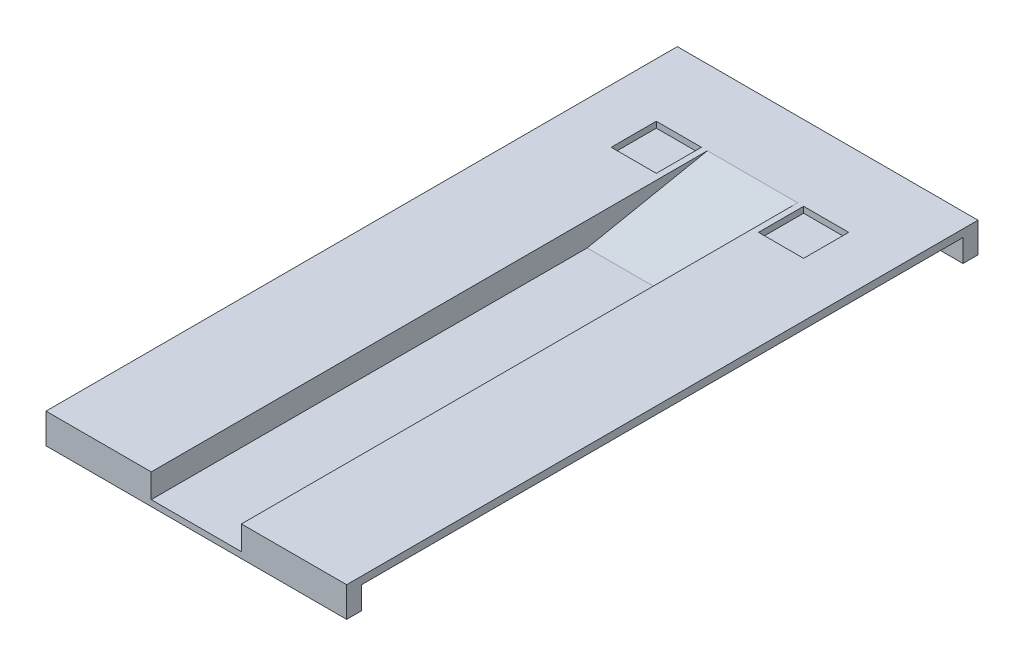
ISO-10303-21;
HEADER;
FILE_DESCRIPTION(('STEP AP214'),'2;1');
FILE_NAME('part.step','',(''),(''),'','','');
FILE_SCHEMA(('AUTOMOTIVE_DESIGN { 1 0 10303 214 1 1 1 1 }'));
ENDSEC;
DATA;
#1=APPLICATION_CONTEXT('core data for automotive mechanical design processes');
#2=APPLICATION_PROTOCOL_DEFINITION('international standard','automotive_design',2000,#1);
#3=PRODUCT_CONTEXT('',#1,'mechanical');
#4=PRODUCT('Part','Part','',(#3));
#5=PRODUCT_RELATED_PRODUCT_CATEGORY('part','',(#4));
#6=PRODUCT_DEFINITION_FORMATION('','',#4);
#7=PRODUCT_DEFINITION_CONTEXT('part definition',#1,'design');
#8=PRODUCT_DEFINITION('design','',#6,#7);
#9=PRODUCT_DEFINITION_SHAPE('','',#8);
#10=(LENGTH_UNIT() NAMED_UNIT(*) SI_UNIT(.MILLI.,.METRE.));
#11=(NAMED_UNIT(*) PLANE_ANGLE_UNIT() SI_UNIT($,.RADIAN.));
#12=(NAMED_UNIT(*) SI_UNIT($,.STERADIAN.) SOLID_ANGLE_UNIT());
#13=UNCERTAINTY_MEASURE_WITH_UNIT(LENGTH_MEASURE(1.E-05),#10,'distance_accuracy_value','');
#14=(GEOMETRIC_REPRESENTATION_CONTEXT(3) GLOBAL_UNCERTAINTY_ASSIGNED_CONTEXT((#13)) GLOBAL_UNIT_ASSIGNED_CONTEXT((#10,
#11,#12)) REPRESENTATION_CONTEXT('',''));
#15=CARTESIAN_POINT('',(0.,0.,0.));
#16=DIRECTION('',(0.,0.,1.));
#17=DIRECTION('',(1.,0.,0.));
#18=AXIS2_PLACEMENT_3D('',#15,#16,#17);
#19=CARTESIAN_POINT('',(35.,2.,210.));
#20=DIRECTION('',(-1.,0.,0.));
#21=DIRECTION('',(0.,0.,1.));
#22=AXIS2_PLACEMENT_3D('',#19,#20,#21);
#23=PLANE('',#22);
#24=DIRECTION('',(0.,0.196116135138184,-0.98058067569092));
#25=VECTOR('',#24,1.);
#26=CARTESIAN_POINT('',(35.,2.,65.));
#27=LINE('',#26,#25);
#28=CARTESIAN_POINT('',(35.,2.,65.));
#29=VERTEX_POINT('',#28);
#30=CARTESIAN_POINT('',(35.,10.,25.));
#31=VERTEX_POINT('',#30);
#32=EDGE_CURVE('E378',#29,#31,#27,.T.);
#33=ORIENTED_EDGE('',*,*,#32,.T.);
#34=DIRECTION('',(0.,0.,1.));
#35=VECTOR('',#34,1.);
#36=CARTESIAN_POINT('',(35.,10.,210.));
#37=LINE('',#36,#35);
#38=CARTESIAN_POINT('',(35.,10.,210.));
#39=VERTEX_POINT('',#38);
#40=EDGE_CURVE('E393',#31,#39,#37,.T.);
#41=ORIENTED_EDGE('',*,*,#40,.T.);
#42=DIRECTION('',(0.,1.,0.));
#43=VECTOR('',#42,1.);
#44=CARTESIAN_POINT('',(35.,2.,210.));
#45=LINE('',#44,#43);
#46=CARTESIAN_POINT('',(35.,2.,210.));
#47=VERTEX_POINT('',#46);
#48=EDGE_CURVE('E409',#47,#39,#45,.T.);
#49=ORIENTED_EDGE('',*,*,#48,.F.);
#50=DIRECTION('',(0.,0.,1.));
#51=VECTOR('',#50,1.);
#52=CARTESIAN_POINT('',(35.,2.,210.));
#53=LINE('',#52,#51);
#54=EDGE_CURVE('E397',#29,#47,#53,.T.);
#55=ORIENTED_EDGE('',*,*,#54,.F.);
#56=EDGE_LOOP('',(#33,#41,#49,#55));
#57=FACE_BOUND('',#56,.T.);
#58=ADVANCED_FACE('F45',(#57),#23,.F.);
#59=CARTESIAN_POINT('',(65.,2.,210.));
#60=DIRECTION('',(1.,0.,0.));
#61=DIRECTION('',(0.,0.,-1.));
#62=AXIS2_PLACEMENT_3D('',#59,#60,#61);
#63=PLANE('',#62);
#64=DIRECTION('',(0.,0.196116135138184,-0.98058067569092));
#65=VECTOR('',#64,1.);
#66=CARTESIAN_POINT('',(65.,2.,65.));
#67=LINE('',#66,#65);
#68=CARTESIAN_POINT('',(65.,2.,65.));
#69=VERTEX_POINT('',#68);
#70=CARTESIAN_POINT('',(65.,10.,25.));
#71=VERTEX_POINT('',#70);
#72=EDGE_CURVE('E369',#69,#71,#67,.T.);
#73=ORIENTED_EDGE('',*,*,#72,.F.);
#74=DIRECTION('',(0.,0.,-1.));
#75=VECTOR('',#74,1.);
#76=CARTESIAN_POINT('',(65.,2.,210.));
#77=LINE('',#76,#75);
#78=CARTESIAN_POINT('',(65.,2.,210.));
#79=VERTEX_POINT('',#78);
#80=EDGE_CURVE('E392',#79,#69,#77,.T.);
#81=ORIENTED_EDGE('',*,*,#80,.F.);
#82=DIRECTION('',(0.,1.,0.));
#83=VECTOR('',#82,1.);
#84=CARTESIAN_POINT('',(65.,2.,210.));
#85=LINE('',#84,#83);
#86=CARTESIAN_POINT('',(65.,10.,210.));
#87=VERTEX_POINT('',#86);
#88=EDGE_CURVE('E400',#79,#87,#85,.T.);
#89=ORIENTED_EDGE('',*,*,#88,.T.);
#90=DIRECTION('',(0.,0.,-1.));
#91=VECTOR('',#90,1.);
#92=CARTESIAN_POINT('',(65.,10.,210.));
#93=LINE('',#92,#91);
#94=EDGE_CURVE('E387',#87,#71,#93,.T.);
#95=ORIENTED_EDGE('',*,*,#94,.T.);
#96=EDGE_LOOP('',(#73,#81,#89,#95));
#97=FACE_BOUND('',#96,.T.);
#98=ADVANCED_FACE('F517',(#97),#63,.F.);
#99=CARTESIAN_POINT('',(0.,2.,0.));
#100=DIRECTION('',(0.,1.,0.));
#101=DIRECTION('',(0.,0.,1.));
#102=AXIS2_PLACEMENT_3D('',#99,#100,#101);
#103=PLANE('',#102);
#104=ORIENTED_EDGE('',*,*,#80,.T.);
#105=DIRECTION('',(1.,0.,0.));
#106=VECTOR('',#105,1.);
#107=CARTESIAN_POINT('',(35.,2.,65.));
#108=LINE('',#107,#106);
#109=EDGE_CURVE('E382',#29,#69,#108,.T.);
#110=ORIENTED_EDGE('',*,*,#109,.F.);
#111=ORIENTED_EDGE('',*,*,#54,.T.);
#112=DIRECTION('',(1.,0.,0.));
#113=VECTOR('',#112,1.);
#114=CARTESIAN_POINT('',(35.,2.,210.));
#115=LINE('',#114,#113);
#116=EDGE_CURVE('E388',#47,#79,#115,.T.);
#117=ORIENTED_EDGE('',*,*,#116,.T.);
#118=EDGE_LOOP('',(#104,#110,#111,#117));
#119=FACE_BOUND('',#118,.T.);
#120=ADVANCED_FACE('F520',(#119),#103,.T.);
#121=CARTESIAN_POINT('',(0.,10.,210.));
#122=DIRECTION('',(1.,0.,0.));
#123=DIRECTION('',(0.,0.,-1.));
#124=AXIS2_PLACEMENT_3D('',#121,#122,#123);
#125=PLANE('',#124);
#126=DIRECTION('',(0.,0.,1.));
#127=VECTOR('',#126,1.);
#128=CARTESIAN_POINT('',(0.,0.,210.));
#129=LINE('',#128,#127);
#130=CARTESIAN_POINT('',(0.,0.,0.));
#131=VERTEX_POINT('',#130);
#132=CARTESIAN_POINT('',(0.,0.,5.));
#133=VERTEX_POINT('',#132);
#134=EDGE_CURVE('E433',#131,#133,#129,.T.);
#135=ORIENTED_EDGE('',*,*,#134,.T.);
#136=DIRECTION('',(0.,-1.,0.));
#137=VECTOR('',#136,1.);
#138=CARTESIAN_POINT('',(0.,0.,5.));
#139=LINE('',#138,#137);
#140=CARTESIAN_POINT('',(0.,7.5,5.));
#141=VERTEX_POINT('',#140);
#142=EDGE_CURVE('E305',#141,#133,#139,.T.);
#143=ORIENTED_EDGE('',*,*,#142,.F.);
#144=DIRECTION('',(0.,0.,-1.));
#145=VECTOR('',#144,1.);
#146=CARTESIAN_POINT('',(0.,7.5,5.));
#147=LINE('',#146,#145);
#148=CARTESIAN_POINT('',(0.,7.5,205.));
#149=VERTEX_POINT('',#148);
#150=EDGE_CURVE('E320',#149,#141,#147,.T.);
#151=ORIENTED_EDGE('',*,*,#150,.F.);
#152=DIRECTION('',(0.,1.,0.));
#153=VECTOR('',#152,1.);
#154=CARTESIAN_POINT('',(0.,7.5,205.));
#155=LINE('',#154,#153);
#156=CARTESIAN_POINT('',(0.,0.,205.));
#157=VERTEX_POINT('',#156);
#158=EDGE_CURVE('E253',#157,#149,#155,.T.);
#159=ORIENTED_EDGE('',*,*,#158,.F.);
#160=CARTESIAN_POINT('',(0.,0.,210.));
#161=VERTEX_POINT('',#160);
#162=EDGE_CURVE('E413',#157,#161,#129,.T.);
#163=ORIENTED_EDGE('',*,*,#162,.T.);
#164=DIRECTION('',(0.,-1.,0.));
#165=VECTOR('',#164,1.);
#166=CARTESIAN_POINT('',(0.,10.,210.));
#167=LINE('',#166,#165);
#168=CARTESIAN_POINT('',(0.,10.,210.));
#169=VERTEX_POINT('',#168);
#170=EDGE_CURVE('E11',#169,#161,#167,.T.);
#171=ORIENTED_EDGE('',*,*,#170,.F.);
#172=DIRECTION('',(0.,0.,1.));
#173=VECTOR('',#172,1.);
#174=CARTESIAN_POINT('',(0.,10.,210.));
#175=LINE('',#174,#173);
#176=CARTESIAN_POINT('',(0.,10.,0.));
#177=VERTEX_POINT('',#176);
#178=EDGE_CURVE('E416',#177,#169,#175,.T.);
#179=ORIENTED_EDGE('',*,*,#178,.F.);
#180=DIRECTION('',(0.,-1.,0.));
#181=VECTOR('',#180,1.);
#182=CARTESIAN_POINT('',(0.,10.,0.));
#183=LINE('',#182,#181);
#184=EDGE_CURVE('E432',#177,#131,#183,.T.);
#185=ORIENTED_EDGE('',*,*,#184,.T.);
#186=EDGE_LOOP('',(#135,#143,#151,#159,#163,#171,#179,#185));
#187=FACE_BOUND('',#186,.T.);
#188=ADVANCED_FACE('F47',(#187),#125,.F.);
#189=CARTESIAN_POINT('',(100.,10.,210.));
#190=DIRECTION('',(0.,0.,-1.));
#191=DIRECTION('',(-1.,0.,0.));
#192=AXIS2_PLACEMENT_3D('',#189,#190,#191);
#193=PLANE('',#192);
#194=ORIENTED_EDGE('',*,*,#116,.F.);
#195=ORIENTED_EDGE('',*,*,#48,.T.);
#196=DIRECTION('',(1.,0.,0.));
#197=VECTOR('',#196,1.);
#198=CARTESIAN_POINT('',(100.,10.,210.));
#199=LINE('',#198,#197);
#200=EDGE_CURVE('E422',#169,#39,#199,.T.);
#201=ORIENTED_EDGE('',*,*,#200,.F.);
#202=ORIENTED_EDGE('',*,*,#170,.T.);
#203=DIRECTION('',(1.,0.,0.));
#204=VECTOR('',#203,1.);
#205=CARTESIAN_POINT('',(100.,0.,210.));
#206=LINE('',#205,#204);
#207=CARTESIAN_POINT('',(100.,0.,210.));
#208=VERTEX_POINT('',#207);
#209=EDGE_CURVE('E437',#161,#208,#206,.T.);
#210=ORIENTED_EDGE('',*,*,#209,.T.);
#211=DIRECTION('',(0.,-1.,0.));
#212=VECTOR('',#211,1.);
#213=CARTESIAN_POINT('',(100.,10.,210.));
#214=LINE('',#213,#212);
#215=CARTESIAN_POINT('',(100.,10.,210.));
#216=VERTEX_POINT('',#215);
#217=EDGE_CURVE('E54',#216,#208,#214,.T.);
#218=ORIENTED_EDGE('',*,*,#217,.F.);
#219=EDGE_CURVE('E420',#87,#216,#199,.T.);
#220=ORIENTED_EDGE('',*,*,#219,.F.);
#221=ORIENTED_EDGE('',*,*,#88,.F.);
#222=EDGE_LOOP('',(#194,#195,#201,#202,#210,#218,#220,#221));
#223=FACE_BOUND('',#222,.T.);
#224=ADVANCED_FACE('F514',(#223),#193,.F.);
#225=CARTESIAN_POINT('',(100.,10.,0.));
#226=DIRECTION('',(-1.,0.,0.));
#227=DIRECTION('',(0.,0.,1.));
#228=AXIS2_PLACEMENT_3D('',#225,#226,#227);
#229=PLANE('',#228);
#230=DIRECTION('',(0.,0.,-1.));
#231=VECTOR('',#230,1.);
#232=CARTESIAN_POINT('',(100.,0.,0.));
#233=LINE('',#232,#231);
#234=CARTESIAN_POINT('',(100.,0.,205.));
#235=VERTEX_POINT('',#234);
#236=EDGE_CURVE('E441',#208,#235,#233,.T.);
#237=ORIENTED_EDGE('',*,*,#236,.T.);
#238=DIRECTION('',(0.,-1.,0.));
#239=VECTOR('',#238,1.);
#240=CARTESIAN_POINT('',(100.,0.,205.));
#241=LINE('',#240,#239);
#242=CARTESIAN_POINT('',(100.,7.5,205.));
#243=VERTEX_POINT('',#242);
#244=EDGE_CURVE('E344',#243,#235,#241,.T.);
#245=ORIENTED_EDGE('',*,*,#244,.F.);
#246=DIRECTION('',(0.,0.,1.));
#247=VECTOR('',#246,1.);
#248=CARTESIAN_POINT('',(100.,7.5,205.));
#249=LINE('',#248,#247);
#250=CARTESIAN_POINT('',(100.,7.5,4.99999999999996));
#251=VERTEX_POINT('',#250);
#252=EDGE_CURVE('E359',#251,#243,#249,.T.);
#253=ORIENTED_EDGE('',*,*,#252,.F.);
#254=DIRECTION('',(0.,1.,0.));
#255=VECTOR('',#254,1.);
#256=CARTESIAN_POINT('',(100.,7.5,4.99999999999996));
#257=LINE('',#256,#255);
#258=CARTESIAN_POINT('',(100.,0.,4.99999999999996));
#259=VERTEX_POINT('',#258);
#260=EDGE_CURVE('E330',#259,#251,#257,.T.);
#261=ORIENTED_EDGE('',*,*,#260,.F.);
#262=CARTESIAN_POINT('',(100.,0.,0.));
#263=VERTEX_POINT('',#262);
#264=EDGE_CURVE('E440',#259,#263,#233,.T.);
#265=ORIENTED_EDGE('',*,*,#264,.T.);
#266=DIRECTION('',(0.,-1.,0.));
#267=VECTOR('',#266,1.);
#268=CARTESIAN_POINT('',(100.,10.,0.));
#269=LINE('',#268,#267);
#270=CARTESIAN_POINT('',(100.,10.,0.));
#271=VERTEX_POINT('',#270);
#272=EDGE_CURVE('E450',#271,#263,#269,.T.);
#273=ORIENTED_EDGE('',*,*,#272,.F.);
#274=DIRECTION('',(0.,0.,-1.));
#275=VECTOR('',#274,1.);
#276=CARTESIAN_POINT('',(100.,10.,0.));
#277=LINE('',#276,#275);
#278=EDGE_CURVE('E426',#216,#271,#277,.T.);
#279=ORIENTED_EDGE('',*,*,#278,.F.);
#280=ORIENTED_EDGE('',*,*,#217,.T.);
#281=EDGE_LOOP('',(#237,#245,#253,#261,#265,#273,#279,#280));
#282=FACE_BOUND('',#281,.T.);
#283=ADVANCED_FACE('F459',(#282),#229,.F.);
#284=CARTESIAN_POINT('',(0.,10.,0.));
#285=DIRECTION('',(0.,0.,1.));
#286=DIRECTION('',(1.,0.,0.));
#287=AXIS2_PLACEMENT_3D('',#284,#285,#286);
#288=PLANE('',#287);
#289=DIRECTION('',(-1.,0.,0.));
#290=VECTOR('',#289,1.);
#291=CARTESIAN_POINT('',(0.,0.,0.));
#292=LINE('',#291,#290);
#293=EDGE_CURVE('E421',#263,#131,#292,.T.);
#294=ORIENTED_EDGE('',*,*,#293,.T.);
#295=ORIENTED_EDGE('',*,*,#184,.F.);
#296=DIRECTION('',(-1.,0.,0.));
#297=VECTOR('',#296,1.);
#298=CARTESIAN_POINT('',(0.,10.,0.));
#299=LINE('',#298,#297);
#300=EDGE_CURVE('E429',#271,#177,#299,.T.);
#301=ORIENTED_EDGE('',*,*,#300,.F.);
#302=ORIENTED_EDGE('',*,*,#272,.T.);
#303=EDGE_LOOP('',(#294,#295,#301,#302));
#304=FACE_BOUND('',#303,.T.);
#305=ADVANCED_FACE('F506',(#304),#288,.F.);
#306=CARTESIAN_POINT('',(0.,10.,0.));
#307=DIRECTION('',(0.,-1.,0.));
#308=DIRECTION('',(0.,0.,-1.));
#309=AXIS2_PLACEMENT_3D('',#306,#307,#308);
#310=PLANE('',#309);
#311=DIRECTION('',(0.,0.,1.));
#312=VECTOR('',#311,1.);
#313=CARTESIAN_POINT('',(18.,10.,40.));
#314=LINE('',#313,#312);
#315=CARTESIAN_POINT('',(18.,10.,25.));
#316=VERTEX_POINT('',#315);
#317=CARTESIAN_POINT('',(18.,10.,40.));
#318=VERTEX_POINT('',#317);
#319=EDGE_CURVE('E243',#316,#318,#314,.T.);
#320=ORIENTED_EDGE('',*,*,#319,.F.);
#321=DIRECTION('',(-1.,0.,0.));
#322=VECTOR('',#321,1.);
#323=CARTESIAN_POINT('',(18.,10.,25.));
#324=LINE('',#323,#322);
#325=CARTESIAN_POINT('',(33.,10.,25.));
#326=VERTEX_POINT('',#325);
#327=EDGE_CURVE('E61',#326,#316,#324,.T.);
#328=ORIENTED_EDGE('',*,*,#327,.F.);
#329=DIRECTION('',(0.,0.,-1.));
#330=VECTOR('',#329,1.);
#331=CARTESIAN_POINT('',(33.,10.,25.));
#332=LINE('',#331,#330);
#333=CARTESIAN_POINT('',(33.,10.,40.));
#334=VERTEX_POINT('',#333);
#335=EDGE_CURVE('E230',#334,#326,#332,.T.);
#336=ORIENTED_EDGE('',*,*,#335,.F.);
#337=DIRECTION('',(1.,0.,0.));
#338=VECTOR('',#337,1.);
#339=CARTESIAN_POINT('',(33.,10.,40.));
#340=LINE('',#339,#338);
#341=EDGE_CURVE('E234',#318,#334,#340,.T.);
#342=ORIENTED_EDGE('',*,*,#341,.F.);
#343=EDGE_LOOP('',(#320,#328,#336,#342));
#344=FACE_BOUND('',#343,.T.);
#345=DIRECTION('',(0.,0.,1.));
#346=VECTOR('',#345,1.);
#347=CARTESIAN_POINT('',(67.,10.,25.));
#348=LINE('',#347,#346);
#349=CARTESIAN_POINT('',(67.,10.,25.));
#350=VERTEX_POINT('',#349);
#351=CARTESIAN_POINT('',(67.,10.,40.));
#352=VERTEX_POINT('',#351);
#353=EDGE_CURVE('E279',#350,#352,#348,.T.);
#354=ORIENTED_EDGE('',*,*,#353,.F.);
#355=DIRECTION('',(-1.,0.,0.));
#356=VECTOR('',#355,1.);
#357=CARTESIAN_POINT('',(82.,10.,25.));
#358=LINE('',#357,#356);
#359=CARTESIAN_POINT('',(82.,10.,25.));
#360=VERTEX_POINT('',#359);
#361=EDGE_CURVE('E69',#360,#350,#358,.T.);
#362=ORIENTED_EDGE('',*,*,#361,.F.);
#363=DIRECTION('',(0.,0.,-1.));
#364=VECTOR('',#363,1.);
#365=CARTESIAN_POINT('',(82.,10.,40.));
#366=LINE('',#365,#364);
#367=CARTESIAN_POINT('',(82.,10.,40.));
#368=VERTEX_POINT('',#367);
#369=EDGE_CURVE('E264',#368,#360,#366,.T.);
#370=ORIENTED_EDGE('',*,*,#369,.F.);
#371=DIRECTION('',(1.,0.,0.));
#372=VECTOR('',#371,1.);
#373=CARTESIAN_POINT('',(67.,10.,40.));
#374=LINE('',#373,#372);
#375=EDGE_CURVE('E283',#352,#368,#374,.T.);
#376=ORIENTED_EDGE('',*,*,#375,.F.);
#377=EDGE_LOOP('',(#354,#362,#370,#376));
#378=FACE_BOUND('',#377,.T.);
#379=ORIENTED_EDGE('',*,*,#200,.T.);
#380=ORIENTED_EDGE('',*,*,#40,.F.);
#381=DIRECTION('',(-1.,0.,0.));
#382=VECTOR('',#381,1.);
#383=CARTESIAN_POINT('',(65.,10.,25.));
#384=LINE('',#383,#382);
#385=EDGE_CURVE('E404',#71,#31,#384,.T.);
#386=ORIENTED_EDGE('',*,*,#385,.F.);
#387=ORIENTED_EDGE('',*,*,#94,.F.);
#388=ORIENTED_EDGE('',*,*,#219,.T.);
#389=ORIENTED_EDGE('',*,*,#278,.T.);
#390=ORIENTED_EDGE('',*,*,#300,.T.);
#391=ORIENTED_EDGE('',*,*,#178,.T.);
#392=EDGE_LOOP('',(#379,#380,#386,#387,#388,#389,#390,#391));
#393=FACE_BOUND('',#392,.T.);
#394=ADVANCED_FACE('F508',(#344,#378,#393),#310,.F.);
#395=CARTESIAN_POINT('',(0.,0.,0.));
#396=DIRECTION('',(0.,-1.,0.));
#397=DIRECTION('',(0.,0.,-1.));
#398=AXIS2_PLACEMENT_3D('',#395,#396,#397);
#399=PLANE('',#398);
#400=DIRECTION('',(-1.,0.,0.));
#401=VECTOR('',#400,1.);
#402=CARTESIAN_POINT('',(10.,0.,5.));
#403=LINE('',#402,#401);
#404=CARTESIAN_POINT('',(10.,0.,5.));
#405=VERTEX_POINT('',#404);
#406=EDGE_CURVE('E326',#405,#133,#403,.T.);
#407=ORIENTED_EDGE('',*,*,#406,.T.);
#408=ORIENTED_EDGE('',*,*,#134,.F.);
#409=ORIENTED_EDGE('',*,*,#293,.F.);
#410=ORIENTED_EDGE('',*,*,#264,.F.);
#411=DIRECTION('',(1.,0.,0.));
#412=VECTOR('',#411,1.);
#413=CARTESIAN_POINT('',(90.,0.,4.99999999999997));
#414=LINE('',#413,#412);
#415=CARTESIAN_POINT('',(90.,0.,4.99999999999997));
#416=VERTEX_POINT('',#415);
#417=EDGE_CURVE('E355',#416,#259,#414,.T.);
#418=ORIENTED_EDGE('',*,*,#417,.F.);
#419=DIRECTION('',(0.,0.,-1.));
#420=VECTOR('',#419,1.);
#421=CARTESIAN_POINT('',(90.,0.,4.99999999999997));
#422=LINE('',#421,#420);
#423=CARTESIAN_POINT('',(90.,0.,205.));
#424=VERTEX_POINT('',#423);
#425=EDGE_CURVE('E339',#424,#416,#422,.T.);
#426=ORIENTED_EDGE('',*,*,#425,.F.);
#427=DIRECTION('',(1.,0.,0.));
#428=VECTOR('',#427,1.);
#429=CARTESIAN_POINT('',(90.,0.,205.));
#430=LINE('',#429,#428);
#431=EDGE_CURVE('E365',#424,#235,#430,.T.);
#432=ORIENTED_EDGE('',*,*,#431,.T.);
#433=ORIENTED_EDGE('',*,*,#236,.F.);
#434=ORIENTED_EDGE('',*,*,#209,.F.);
#435=ORIENTED_EDGE('',*,*,#162,.F.);
#436=DIRECTION('',(-1.,0.,0.));
#437=VECTOR('',#436,1.);
#438=CARTESIAN_POINT('',(10.,0.,205.));
#439=LINE('',#438,#437);
#440=CARTESIAN_POINT('',(10.,0.,205.));
#441=VERTEX_POINT('',#440);
#442=EDGE_CURVE('E316',#441,#157,#439,.T.);
#443=ORIENTED_EDGE('',*,*,#442,.F.);
#444=DIRECTION('',(0.,0.,1.));
#445=VECTOR('',#444,1.);
#446=CARTESIAN_POINT('',(10.,0.,205.));
#447=LINE('',#446,#445);
#448=EDGE_CURVE('E300',#405,#441,#447,.T.);
#449=ORIENTED_EDGE('',*,*,#448,.F.);
#450=EDGE_LOOP('',(#407,#408,#409,#410,#418,#426,#432,#433,#434,#435,#443,#449));
#451=FACE_BOUND('',#450,.T.);
#452=ADVANCED_FACE('F466',(#451),#399,.T.);
#453=CARTESIAN_POINT('',(35.,2.,65.));
#454=DIRECTION('',(0.,-0.98058067569092,-0.196116135138184));
#455=DIRECTION('',(0.,0.196116135138184,-0.98058067569092));
#456=AXIS2_PLACEMENT_3D('',#453,#454,#455);
#457=PLANE('',#456);
#458=ORIENTED_EDGE('',*,*,#72,.T.);
#459=ORIENTED_EDGE('',*,*,#385,.T.);
#460=ORIENTED_EDGE('',*,*,#32,.F.);
#461=ORIENTED_EDGE('',*,*,#109,.T.);
#462=EDGE_LOOP('',(#458,#459,#460,#461));
#463=FACE_BOUND('',#462,.T.);
#464=ADVANCED_FACE('F526',(#463),#457,.F.);
#465=CARTESIAN_POINT('',(90.,0.,205.));
#466=DIRECTION('',(0.,0.,1.));
#467=DIRECTION('',(1.,0.,0.));
#468=AXIS2_PLACEMENT_3D('',#465,#466,#467);
#469=PLANE('',#468);
#470=ORIENTED_EDGE('',*,*,#244,.T.);
#471=ORIENTED_EDGE('',*,*,#431,.F.);
#472=DIRECTION('',(0.,-1.,0.));
#473=VECTOR('',#472,1.);
#474=CARTESIAN_POINT('',(90.,0.,205.));
#475=LINE('',#474,#473);
#476=CARTESIAN_POINT('',(90.,7.5,205.));
#477=VERTEX_POINT('',#476);
#478=EDGE_CURVE('E352',#477,#424,#475,.T.);
#479=ORIENTED_EDGE('',*,*,#478,.F.);
#480=DIRECTION('',(1.,0.,0.));
#481=VECTOR('',#480,1.);
#482=CARTESIAN_POINT('',(90.,7.5,205.));
#483=LINE('',#482,#481);
#484=EDGE_CURVE('E370',#477,#243,#483,.T.);
#485=ORIENTED_EDGE('',*,*,#484,.T.);
#486=EDGE_LOOP('',(#470,#471,#479,#485));
#487=FACE_BOUND('',#486,.T.);
#488=ADVANCED_FACE('F473',(#487),#469,.F.);
#489=CARTESIAN_POINT('',(90.,7.5,205.));
#490=DIRECTION('',(0.,1.,0.));
#491=DIRECTION('',(0.,0.,1.));
#492=AXIS2_PLACEMENT_3D('',#489,#490,#491);
#493=PLANE('',#492);
#494=ORIENTED_EDGE('',*,*,#252,.T.);
#495=ORIENTED_EDGE('',*,*,#484,.F.);
#496=DIRECTION('',(0.,0.,1.));
#497=VECTOR('',#496,1.);
#498=CARTESIAN_POINT('',(90.,7.5,205.));
#499=LINE('',#498,#497);
#500=CARTESIAN_POINT('',(90.,7.5,4.99999999999997));
#501=VERTEX_POINT('',#500);
#502=EDGE_CURVE('E348',#501,#477,#499,.T.);
#503=ORIENTED_EDGE('',*,*,#502,.F.);
#504=DIRECTION('',(1.,0.,0.));
#505=VECTOR('',#504,1.);
#506=CARTESIAN_POINT('',(90.,7.5,4.99999999999997));
#507=LINE('',#506,#505);
#508=EDGE_CURVE('E373',#501,#251,#507,.T.);
#509=ORIENTED_EDGE('',*,*,#508,.T.);
#510=EDGE_LOOP('',(#494,#495,#503,#509));
#511=FACE_BOUND('',#510,.T.);
#512=ADVANCED_FACE('F478',(#511),#493,.F.);
#513=CARTESIAN_POINT('',(90.,7.5,4.99999999999997));
#514=DIRECTION('',(0.,0.,-1.));
#515=DIRECTION('',(-1.,0.,0.));
#516=AXIS2_PLACEMENT_3D('',#513,#514,#515);
#517=PLANE('',#516);
#518=ORIENTED_EDGE('',*,*,#260,.T.);
#519=ORIENTED_EDGE('',*,*,#508,.F.);
#520=DIRECTION('',(0.,1.,0.));
#521=VECTOR('',#520,1.);
#522=CARTESIAN_POINT('',(90.,7.5,4.99999999999997));
#523=LINE('',#522,#521);
#524=EDGE_CURVE('E343',#416,#501,#523,.T.);
#525=ORIENTED_EDGE('',*,*,#524,.F.);
#526=ORIENTED_EDGE('',*,*,#417,.T.);
#527=EDGE_LOOP('',(#518,#519,#525,#526));
#528=FACE_BOUND('',#527,.T.);
#529=ADVANCED_FACE('F481',(#528),#517,.F.);
#530=CARTESIAN_POINT('',(90.,0.,0.));
#531=DIRECTION('',(-1.,0.,0.));
#532=DIRECTION('',(0.,0.,1.));
#533=AXIS2_PLACEMENT_3D('',#530,#531,#532);
#534=PLANE('',#533);
#535=ORIENTED_EDGE('',*,*,#425,.T.);
#536=ORIENTED_EDGE('',*,*,#524,.T.);
#537=ORIENTED_EDGE('',*,*,#502,.T.);
#538=ORIENTED_EDGE('',*,*,#478,.T.);
#539=EDGE_LOOP('',(#535,#536,#537,#538));
#540=FACE_BOUND('',#539,.T.);
#541=ADVANCED_FACE('F586',(#540),#534,.F.);
#542=CARTESIAN_POINT('',(10.,0.,5.));
#543=DIRECTION('',(0.,0.,-1.));
#544=DIRECTION('',(-1.,0.,0.));
#545=AXIS2_PLACEMENT_3D('',#542,#543,#544);
#546=PLANE('',#545);
#547=ORIENTED_EDGE('',*,*,#142,.T.);
#548=ORIENTED_EDGE('',*,*,#406,.F.);
#549=DIRECTION('',(0.,-1.,0.));
#550=VECTOR('',#549,1.);
#551=CARTESIAN_POINT('',(10.,0.,5.));
#552=LINE('',#551,#550);
#553=CARTESIAN_POINT('',(10.,7.5,5.));
#554=VERTEX_POINT('',#553);
#555=EDGE_CURVE('E313',#554,#405,#552,.T.);
#556=ORIENTED_EDGE('',*,*,#555,.F.);
#557=DIRECTION('',(-1.,0.,0.));
#558=VECTOR('',#557,1.);
#559=CARTESIAN_POINT('',(10.,7.5,5.));
#560=LINE('',#559,#558);
#561=EDGE_CURVE('E331',#554,#141,#560,.T.);
#562=ORIENTED_EDGE('',*,*,#561,.T.);
#563=EDGE_LOOP('',(#547,#548,#556,#562));
#564=FACE_BOUND('',#563,.T.);
#565=ADVANCED_FACE('F501',(#564),#546,.F.);
#566=CARTESIAN_POINT('',(10.,7.5,5.));
#567=DIRECTION('',(0.,1.,0.));
#568=DIRECTION('',(0.,0.,1.));
#569=AXIS2_PLACEMENT_3D('',#566,#567,#568);
#570=PLANE('',#569);
#571=ORIENTED_EDGE('',*,*,#150,.T.);
#572=ORIENTED_EDGE('',*,*,#561,.F.);
#573=DIRECTION('',(0.,0.,-1.));
#574=VECTOR('',#573,1.);
#575=CARTESIAN_POINT('',(10.,7.5,5.));
#576=LINE('',#575,#574);
#577=CARTESIAN_POINT('',(10.,7.5,205.));
#578=VERTEX_POINT('',#577);
#579=EDGE_CURVE('E309',#578,#554,#576,.T.);
#580=ORIENTED_EDGE('',*,*,#579,.F.);
#581=DIRECTION('',(-1.,0.,0.));
#582=VECTOR('',#581,1.);
#583=CARTESIAN_POINT('',(10.,7.5,205.));
#584=LINE('',#583,#582);
#585=EDGE_CURVE('E334',#578,#149,#584,.T.);
#586=ORIENTED_EDGE('',*,*,#585,.T.);
#587=EDGE_LOOP('',(#571,#572,#580,#586));
#588=FACE_BOUND('',#587,.T.);
#589=ADVANCED_FACE('F598',(#588),#570,.F.);
#590=CARTESIAN_POINT('',(10.,7.5,205.));
#591=DIRECTION('',(0.,0.,1.));
#592=DIRECTION('',(0.,-1.,0.));
#593=AXIS2_PLACEMENT_3D('',#590,#591,#592);
#594=PLANE('',#593);
#595=ORIENTED_EDGE('',*,*,#158,.T.);
#596=ORIENTED_EDGE('',*,*,#585,.F.);
#597=DIRECTION('',(0.,1.,0.));
#598=VECTOR('',#597,1.);
#599=CARTESIAN_POINT('',(10.,7.5,205.));
#600=LINE('',#599,#598);
#601=EDGE_CURVE('E304',#441,#578,#600,.T.);
#602=ORIENTED_EDGE('',*,*,#601,.F.);
#603=ORIENTED_EDGE('',*,*,#442,.T.);
#604=EDGE_LOOP('',(#595,#596,#602,#603));
#605=FACE_BOUND('',#604,.T.);
#606=ADVANCED_FACE('F494',(#605),#594,.F.);
#607=CARTESIAN_POINT('',(10.,0.,0.));
#608=DIRECTION('',(1.,0.,0.));
#609=DIRECTION('',(0.,0.,-1.));
#610=AXIS2_PLACEMENT_3D('',#607,#608,#609);
#611=PLANE('',#610);
#612=ORIENTED_EDGE('',*,*,#448,.T.);
#613=ORIENTED_EDGE('',*,*,#601,.T.);
#614=ORIENTED_EDGE('',*,*,#579,.T.);
#615=ORIENTED_EDGE('',*,*,#555,.T.);
#616=EDGE_LOOP('',(#612,#613,#614,#615));
#617=FACE_BOUND('',#616,.T.);
#618=ADVANCED_FACE('F497',(#617),#611,.F.);
#619=CARTESIAN_POINT('',(82.,8.,25.));
#620=DIRECTION('',(0.,0.,-1.));
#621=DIRECTION('',(-1.,0.,0.));
#622=AXIS2_PLACEMENT_3D('',#619,#620,#621);
#623=PLANE('',#622);
#624=ORIENTED_EDGE('',*,*,#361,.T.);
#625=DIRECTION('',(0.,1.,0.));
#626=VECTOR('',#625,1.);
#627=CARTESIAN_POINT('',(67.,8.,25.));
#628=LINE('',#627,#626);
#629=CARTESIAN_POINT('',(67.,8.,25.));
#630=VERTEX_POINT('',#629);
#631=EDGE_CURVE('E276',#630,#350,#628,.T.);
#632=ORIENTED_EDGE('',*,*,#631,.F.);
#633=DIRECTION('',(-1.,0.,0.));
#634=VECTOR('',#633,1.);
#635=CARTESIAN_POINT('',(82.,8.,25.));
#636=LINE('',#635,#634);
#637=CARTESIAN_POINT('',(82.,8.,25.));
#638=VERTEX_POINT('',#637);
#639=EDGE_CURVE('E259',#638,#630,#636,.T.);
#640=ORIENTED_EDGE('',*,*,#639,.F.);
#641=DIRECTION('',(0.,1.,0.));
#642=VECTOR('',#641,1.);
#643=CARTESIAN_POINT('',(82.,8.,25.));
#644=LINE('',#643,#642);
#645=EDGE_CURVE('E244',#638,#360,#644,.T.);
#646=ORIENTED_EDGE('',*,*,#645,.T.);
#647=EDGE_LOOP('',(#624,#632,#640,#646));
#648=FACE_BOUND('',#647,.T.);
#649=ADVANCED_FACE('F618',(#648),#623,.F.);
#650=CARTESIAN_POINT('',(82.,8.,40.));
#651=DIRECTION('',(1.,0.,0.));
#652=DIRECTION('',(0.,0.,-1.));
#653=AXIS2_PLACEMENT_3D('',#650,#651,#652);
#654=PLANE('',#653);
#655=ORIENTED_EDGE('',*,*,#369,.T.);
#656=ORIENTED_EDGE('',*,*,#645,.F.);
#657=DIRECTION('',(0.,0.,-1.));
#658=VECTOR('',#657,1.);
#659=CARTESIAN_POINT('',(82.,8.,40.));
#660=LINE('',#659,#658);
#661=CARTESIAN_POINT('',(82.,8.,40.));
#662=VERTEX_POINT('',#661);
#663=EDGE_CURVE('E272',#662,#638,#660,.T.);
#664=ORIENTED_EDGE('',*,*,#663,.F.);
#665=DIRECTION('',(0.,1.,0.));
#666=VECTOR('',#665,1.);
#667=CARTESIAN_POINT('',(82.,8.,40.));
#668=LINE('',#667,#666);
#669=EDGE_CURVE('E292',#662,#368,#668,.T.);
#670=ORIENTED_EDGE('',*,*,#669,.T.);
#671=EDGE_LOOP('',(#655,#656,#664,#670));
#672=FACE_BOUND('',#671,.T.);
#673=ADVANCED_FACE('F625',(#672),#654,.F.);
#674=CARTESIAN_POINT('',(67.,8.,40.));
#675=DIRECTION('',(0.,0.,1.));
#676=DIRECTION('',(1.,0.,0.));
#677=AXIS2_PLACEMENT_3D('',#674,#675,#676);
#678=PLANE('',#677);
#679=ORIENTED_EDGE('',*,*,#375,.T.);
#680=ORIENTED_EDGE('',*,*,#669,.F.);
#681=DIRECTION('',(1.,0.,0.));
#682=VECTOR('',#681,1.);
#683=CARTESIAN_POINT('',(67.,8.,40.));
#684=LINE('',#683,#682);
#685=CARTESIAN_POINT('',(67.,8.,40.));
#686=VERTEX_POINT('',#685);
#687=EDGE_CURVE('E268',#686,#662,#684,.T.);
#688=ORIENTED_EDGE('',*,*,#687,.F.);
#689=DIRECTION('',(0.,1.,0.));
#690=VECTOR('',#689,1.);
#691=CARTESIAN_POINT('',(67.,8.,40.));
#692=LINE('',#691,#690);
#693=EDGE_CURVE('E295',#686,#352,#692,.T.);
#694=ORIENTED_EDGE('',*,*,#693,.T.);
#695=EDGE_LOOP('',(#679,#680,#688,#694));
#696=FACE_BOUND('',#695,.T.);
#697=ADVANCED_FACE('F632',(#696),#678,.F.);
#698=CARTESIAN_POINT('',(67.,8.,25.));
#699=DIRECTION('',(-1.,0.,0.));
#700=DIRECTION('',(0.,0.,1.));
#701=AXIS2_PLACEMENT_3D('',#698,#699,#700);
#702=PLANE('',#701);
#703=ORIENTED_EDGE('',*,*,#353,.T.);
#704=ORIENTED_EDGE('',*,*,#693,.F.);
#705=DIRECTION('',(0.,0.,1.));
#706=VECTOR('',#705,1.);
#707=CARTESIAN_POINT('',(67.,8.,25.));
#708=LINE('',#707,#706);
#709=EDGE_CURVE('E263',#630,#686,#708,.T.);
#710=ORIENTED_EDGE('',*,*,#709,.F.);
#711=ORIENTED_EDGE('',*,*,#631,.T.);
#712=EDGE_LOOP('',(#703,#704,#710,#711));
#713=FACE_BOUND('',#712,.T.);
#714=ADVANCED_FACE('F640',(#713),#702,.F.);
#715=CARTESIAN_POINT('',(0.,8.,0.));
#716=DIRECTION('',(0.,1.,0.));
#717=DIRECTION('',(0.,0.,1.));
#718=AXIS2_PLACEMENT_3D('',#715,#716,#717);
#719=PLANE('',#718);
#720=ORIENTED_EDGE('',*,*,#639,.T.);
#721=ORIENTED_EDGE('',*,*,#709,.T.);
#722=ORIENTED_EDGE('',*,*,#687,.T.);
#723=ORIENTED_EDGE('',*,*,#663,.T.);
#724=EDGE_LOOP('',(#720,#721,#722,#723));
#725=FACE_BOUND('',#724,.T.);
#726=ADVANCED_FACE('F648',(#725),#719,.T.);
#727=CARTESIAN_POINT('',(18.,8.,25.));
#728=DIRECTION('',(0.,0.,-1.));
#729=DIRECTION('',(-1.,0.,0.));
#730=AXIS2_PLACEMENT_3D('',#727,#728,#729);
#731=PLANE('',#730);
#732=ORIENTED_EDGE('',*,*,#327,.T.);
#733=DIRECTION('',(0.,1.,0.));
#734=VECTOR('',#733,1.);
#735=CARTESIAN_POINT('',(18.,8.,25.));
#736=LINE('',#735,#734);
#737=CARTESIAN_POINT('',(18.,8.,25.));
#738=VERTEX_POINT('',#737);
#739=EDGE_CURVE('E205',#738,#316,#736,.T.);
#740=ORIENTED_EDGE('',*,*,#739,.F.);
#741=DIRECTION('',(-1.,0.,0.));
#742=VECTOR('',#741,1.);
#743=CARTESIAN_POINT('',(18.,8.,25.));
#744=LINE('',#743,#742);
#745=CARTESIAN_POINT('',(33.,8.,25.));
#746=VERTEX_POINT('',#745);
#747=EDGE_CURVE('E209',#746,#738,#744,.T.);
#748=ORIENTED_EDGE('',*,*,#747,.F.);
#749=DIRECTION('',(0.,1.,0.));
#750=VECTOR('',#749,1.);
#751=CARTESIAN_POINT('',(33.,8.,25.));
#752=LINE('',#751,#750);
#753=EDGE_CURVE('E250',#746,#326,#752,.T.);
#754=ORIENTED_EDGE('',*,*,#753,.T.);
#755=EDGE_LOOP('',(#732,#740,#748,#754));
#756=FACE_BOUND('',#755,.T.);
#757=ADVANCED_FACE('F207',(#756),#731,.F.);
#758=CARTESIAN_POINT('',(33.,8.,25.));
#759=DIRECTION('',(1.,0.,0.));
#760=DIRECTION('',(0.,0.,-1.));
#761=AXIS2_PLACEMENT_3D('',#758,#759,#760);
#762=PLANE('',#761);
#763=ORIENTED_EDGE('',*,*,#335,.T.);
#764=ORIENTED_EDGE('',*,*,#753,.F.);
#765=DIRECTION('',(0.,0.,-1.));
#766=VECTOR('',#765,1.);
#767=CARTESIAN_POINT('',(33.,8.,25.));
#768=LINE('',#767,#766);
#769=CARTESIAN_POINT('',(33.,8.,40.));
#770=VERTEX_POINT('',#769);
#771=EDGE_CURVE('E216',#770,#746,#768,.T.);
#772=ORIENTED_EDGE('',*,*,#771,.F.);
#773=DIRECTION('',(0.,1.,0.));
#774=VECTOR('',#773,1.);
#775=CARTESIAN_POINT('',(33.,8.,40.));
#776=LINE('',#775,#774);
#777=EDGE_CURVE('E254',#770,#334,#776,.T.);
#778=ORIENTED_EDGE('',*,*,#777,.T.);
#779=EDGE_LOOP('',(#763,#764,#772,#778));
#780=FACE_BOUND('',#779,.T.);
#781=ADVANCED_FACE('F663',(#780),#762,.F.);
#782=CARTESIAN_POINT('',(33.,8.,40.));
#783=DIRECTION('',(0.,0.,1.));
#784=DIRECTION('',(1.,0.,0.));
#785=AXIS2_PLACEMENT_3D('',#782,#783,#784);
#786=PLANE('',#785);
#787=ORIENTED_EDGE('',*,*,#341,.T.);
#788=ORIENTED_EDGE('',*,*,#777,.F.);
#789=DIRECTION('',(1.,0.,0.));
#790=VECTOR('',#789,1.);
#791=CARTESIAN_POINT('',(33.,8.,40.));
#792=LINE('',#791,#790);
#793=CARTESIAN_POINT('',(18.,8.,40.));
#794=VERTEX_POINT('',#793);
#795=EDGE_CURVE('E225',#794,#770,#792,.T.);
#796=ORIENTED_EDGE('',*,*,#795,.F.);
#797=DIRECTION('',(0.,1.,0.));
#798=VECTOR('',#797,1.);
#799=CARTESIAN_POINT('',(18.,8.,40.));
#800=LINE('',#799,#798);
#801=EDGE_CURVE('E215',#794,#318,#800,.T.);
#802=ORIENTED_EDGE('',*,*,#801,.T.);
#803=EDGE_LOOP('',(#787,#788,#796,#802));
#804=FACE_BOUND('',#803,.T.);
#805=ADVANCED_FACE('F670',(#804),#786,.F.);
#806=CARTESIAN_POINT('',(18.,8.,40.));
#807=DIRECTION('',(-1.,0.,0.));
#808=DIRECTION('',(0.,0.,1.));
#809=AXIS2_PLACEMENT_3D('',#806,#807,#808);
#810=PLANE('',#809);
#811=ORIENTED_EDGE('',*,*,#319,.T.);
#812=ORIENTED_EDGE('',*,*,#801,.F.);
#813=DIRECTION('',(0.,0.,1.));
#814=VECTOR('',#813,1.);
#815=CARTESIAN_POINT('',(18.,8.,40.));
#816=LINE('',#815,#814);
#817=EDGE_CURVE('E219',#738,#794,#816,.T.);
#818=ORIENTED_EDGE('',*,*,#817,.F.);
#819=ORIENTED_EDGE('',*,*,#739,.T.);
#820=EDGE_LOOP('',(#811,#812,#818,#819));
#821=FACE_BOUND('',#820,.T.);
#822=ADVANCED_FACE('F220',(#821),#810,.F.);
#823=CARTESIAN_POINT('',(0.,8.,0.));
#824=DIRECTION('',(0.,-1.,0.));
#825=DIRECTION('',(0.,0.,-1.));
#826=AXIS2_PLACEMENT_3D('',#823,#824,#825);
#827=PLANE('',#826);
#828=ORIENTED_EDGE('',*,*,#747,.T.);
#829=ORIENTED_EDGE('',*,*,#817,.T.);
#830=ORIENTED_EDGE('',*,*,#795,.T.);
#831=ORIENTED_EDGE('',*,*,#771,.T.);
#832=EDGE_LOOP('',(#828,#829,#830,#831));
#833=FACE_BOUND('',#832,.T.);
#834=ADVANCED_FACE('F227',(#833),#827,.F.);
#835=CLOSED_SHELL('',(#58,#98,#120,#188,#224,#283,#305,#394,#452,#464,#488,#512,#529,#541,#565,
#589,#606,#618,#649,#673,#697,#714,#726,#757,#781,#805,#822,#834));
#836=MANIFOLD_SOLID_BREP('B2',#835);
#837=ADVANCED_BREP_SHAPE_REPRESENTATION('',(#18,#836),#14);
#838=SHAPE_DEFINITION_REPRESENTATION(#9,#837);
ENDSEC;
END-ISO-10303-21;
